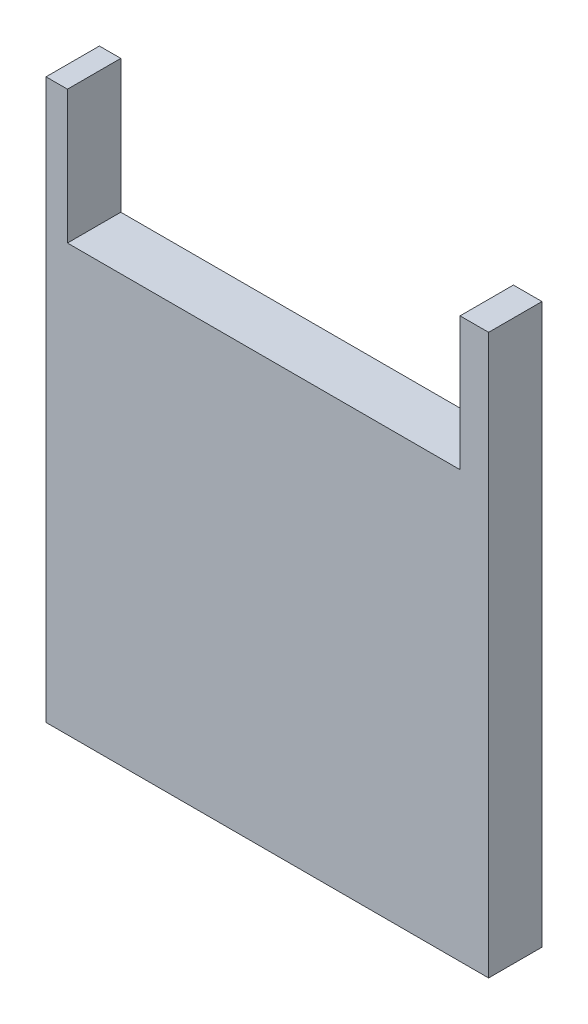
ISO-10303-21;
HEADER;
FILE_DESCRIPTION(('STEP AP214'),'2;1');
FILE_NAME('part.step','',(''),(''),'','','');
FILE_SCHEMA(('AUTOMOTIVE_DESIGN { 1 0 10303 214 1 1 1 1 }'));
ENDSEC;
DATA;
#1=APPLICATION_CONTEXT('core data for automotive mechanical design processes');
#2=APPLICATION_PROTOCOL_DEFINITION('international standard','automotive_design',2000,#1);
#3=PRODUCT_CONTEXT('',#1,'mechanical');
#4=PRODUCT('Part','Part','',(#3));
#5=PRODUCT_RELATED_PRODUCT_CATEGORY('part','',(#4));
#6=PRODUCT_DEFINITION_FORMATION('','',#4);
#7=PRODUCT_DEFINITION_CONTEXT('part definition',#1,'design');
#8=PRODUCT_DEFINITION('design','',#6,#7);
#9=PRODUCT_DEFINITION_SHAPE('','',#8);
#10=(LENGTH_UNIT() NAMED_UNIT(*) SI_UNIT(.MILLI.,.METRE.));
#11=(NAMED_UNIT(*) PLANE_ANGLE_UNIT() SI_UNIT($,.RADIAN.));
#12=(NAMED_UNIT(*) SI_UNIT($,.STERADIAN.) SOLID_ANGLE_UNIT());
#13=UNCERTAINTY_MEASURE_WITH_UNIT(LENGTH_MEASURE(1.E-05),#10,'distance_accuracy_value','');
#14=(GEOMETRIC_REPRESENTATION_CONTEXT(3) GLOBAL_UNCERTAINTY_ASSIGNED_CONTEXT((#13)) GLOBAL_UNIT_ASSIGNED_CONTEXT((#10,
#11,#12)) REPRESENTATION_CONTEXT('',''));
#15=CARTESIAN_POINT('',(0.,0.,0.));
#16=DIRECTION('',(0.,0.,1.));
#17=DIRECTION('',(1.,0.,0.));
#18=AXIS2_PLACEMENT_3D('',#15,#16,#17);
#19=CARTESIAN_POINT('',(22.2134698652141,38.0037677212096,6.));
#20=DIRECTION('',(-1.,0.,0.));
#21=DIRECTION('',(0.,0.,1.));
#22=AXIS2_PLACEMENT_3D('',#19,#20,#21);
#23=PLANE('',#22);
#24=DIRECTION('',(0.,1.,0.));
#25=VECTOR('',#24,1.);
#26=CARTESIAN_POINT('',(22.2134698652141,38.0037677212096,0.));
#27=LINE('',#26,#25);
#28=CARTESIAN_POINT('',(22.2134698652141,-24.8897915357218,0.));
#29=VERTEX_POINT('',#28);
#30=CARTESIAN_POINT('',(22.2134698652141,38.0037677212096,0.));
#31=VERTEX_POINT('',#30);
#32=EDGE_CURVE('E136',#29,#31,#27,.T.);
#33=ORIENTED_EDGE('',*,*,#32,.T.);
#34=DIRECTION('',(0.,0.,-1.));
#35=VECTOR('',#34,1.);
#36=CARTESIAN_POINT('',(22.2134698652141,38.0037677212096,6.));
#37=LINE('',#36,#35);
#38=CARTESIAN_POINT('',(22.2134698652141,38.0037677212096,6.));
#39=VERTEX_POINT('',#38);
#40=EDGE_CURVE('E44',#39,#31,#37,.T.);
#41=ORIENTED_EDGE('',*,*,#40,.F.);
#42=DIRECTION('',(0.,1.,0.));
#43=VECTOR('',#42,1.);
#44=CARTESIAN_POINT('',(22.2134698652141,38.0037677212096,6.));
#45=LINE('',#44,#43);
#46=CARTESIAN_POINT('',(22.2134698652141,-24.8897915357218,6.));
#47=VERTEX_POINT('',#46);
#48=EDGE_CURVE('E96',#47,#39,#45,.T.);
#49=ORIENTED_EDGE('',*,*,#48,.F.);
#50=DIRECTION('',(0.,0.,-1.));
#51=VECTOR('',#50,1.);
#52=CARTESIAN_POINT('',(22.2134698652141,-24.8897915357218,6.));
#53=LINE('',#52,#51);
#54=EDGE_CURVE('E11',#47,#29,#53,.T.);
#55=ORIENTED_EDGE('',*,*,#54,.T.);
#56=EDGE_LOOP('',(#33,#41,#49,#55));
#57=FACE_BOUND('',#56,.T.);
#58=ADVANCED_FACE('F36',(#57),#23,.F.);
#59=CARTESIAN_POINT('',(19.0018838606048,38.0037677212096,6.));
#60=DIRECTION('',(0.,-1.,0.));
#61=DIRECTION('',(0.,0.,-1.));
#62=AXIS2_PLACEMENT_3D('',#59,#60,#61);
#63=PLANE('',#62);
#64=DIRECTION('',(-1.,0.,0.));
#65=VECTOR('',#64,1.);
#66=CARTESIAN_POINT('',(19.0018838606048,38.0037677212096,0.));
#67=LINE('',#66,#65);
#68=CARTESIAN_POINT('',(19.0018838606048,38.0037677212096,0.));
#69=VERTEX_POINT('',#68);
#70=EDGE_CURVE('E138',#31,#69,#67,.T.);
#71=ORIENTED_EDGE('',*,*,#70,.T.);
#72=DIRECTION('',(0.,0.,-1.));
#73=VECTOR('',#72,1.);
#74=CARTESIAN_POINT('',(19.0018838606048,38.0037677212096,6.));
#75=LINE('',#74,#73);
#76=CARTESIAN_POINT('',(19.0018838606048,38.0037677212096,6.));
#77=VERTEX_POINT('',#76);
#78=EDGE_CURVE('E155',#77,#69,#75,.T.);
#79=ORIENTED_EDGE('',*,*,#78,.F.);
#80=DIRECTION('',(-1.,0.,0.));
#81=VECTOR('',#80,1.);
#82=CARTESIAN_POINT('',(19.0018838606048,38.0037677212096,6.));
#83=LINE('',#82,#81);
#84=EDGE_CURVE('E163',#39,#77,#83,.T.);
#85=ORIENTED_EDGE('',*,*,#84,.F.);
#86=ORIENTED_EDGE('',*,*,#40,.T.);
#87=EDGE_LOOP('',(#71,#79,#85,#86));
#88=FACE_BOUND('',#87,.T.);
#89=ADVANCED_FACE('F161',(#88),#63,.F.);
#90=CARTESIAN_POINT('',(19.0018838606048,23.0163663663664,6.));
#91=DIRECTION('',(1.,0.,0.));
#92=DIRECTION('',(0.,0.,-1.));
#93=AXIS2_PLACEMENT_3D('',#90,#91,#92);
#94=PLANE('',#93);
#95=DIRECTION('',(0.,-1.,0.));
#96=VECTOR('',#95,1.);
#97=CARTESIAN_POINT('',(19.0018838606048,23.0163663663664,0.));
#98=LINE('',#97,#96);
#99=CARTESIAN_POINT('',(19.0018838606048,23.0163663663664,0.));
#100=VERTEX_POINT('',#99);
#101=EDGE_CURVE('E140',#69,#100,#98,.T.);
#102=ORIENTED_EDGE('',*,*,#101,.T.);
#103=DIRECTION('',(0.,0.,-1.));
#104=VECTOR('',#103,1.);
#105=CARTESIAN_POINT('',(19.0018838606048,23.0163663663664,6.));
#106=LINE('',#105,#104);
#107=CARTESIAN_POINT('',(19.0018838606048,23.0163663663664,6.));
#108=VERTEX_POINT('',#107);
#109=EDGE_CURVE('E152',#108,#100,#106,.T.);
#110=ORIENTED_EDGE('',*,*,#109,.F.);
#111=DIRECTION('',(0.,-1.,0.));
#112=VECTOR('',#111,1.);
#113=CARTESIAN_POINT('',(19.0018838606048,23.0163663663664,6.));
#114=LINE('',#113,#112);
#115=EDGE_CURVE('E176',#77,#108,#114,.T.);
#116=ORIENTED_EDGE('',*,*,#115,.F.);
#117=ORIENTED_EDGE('',*,*,#78,.T.);
#118=EDGE_LOOP('',(#102,#110,#116,#117));
#119=FACE_BOUND('',#118,.T.);
#120=ADVANCED_FACE('F172',(#119),#94,.F.);
#121=CARTESIAN_POINT('',(-25.1574237027725,23.0163663663664,6.));
#122=DIRECTION('',(0.,-1.,0.));
#123=DIRECTION('',(0.,0.,-1.));
#124=AXIS2_PLACEMENT_3D('',#121,#122,#123);
#125=PLANE('',#124);
#126=DIRECTION('',(-1.,0.,0.));
#127=VECTOR('',#126,1.);
#128=CARTESIAN_POINT('',(-25.1574237027725,23.0163663663664,0.));
#129=LINE('',#128,#127);
#130=CARTESIAN_POINT('',(-25.1574237027725,23.0163663663664,0.));
#131=VERTEX_POINT('',#130);
#132=EDGE_CURVE('E142',#100,#131,#129,.T.);
#133=ORIENTED_EDGE('',*,*,#132,.T.);
#134=DIRECTION('',(0.,0.,-1.));
#135=VECTOR('',#134,1.);
#136=CARTESIAN_POINT('',(-25.1574237027725,23.0163663663664,6.));
#137=LINE('',#136,#135);
#138=CARTESIAN_POINT('',(-25.1574237027725,23.0163663663664,6.));
#139=VERTEX_POINT('',#138);
#140=EDGE_CURVE('E125',#139,#131,#137,.T.);
#141=ORIENTED_EDGE('',*,*,#140,.F.);
#142=DIRECTION('',(-1.,0.,0.));
#143=VECTOR('',#142,1.);
#144=CARTESIAN_POINT('',(-25.1574237027725,23.0163663663664,6.));
#145=LINE('',#144,#143);
#146=EDGE_CURVE('E116',#108,#139,#145,.T.);
#147=ORIENTED_EDGE('',*,*,#146,.F.);
#148=ORIENTED_EDGE('',*,*,#109,.T.);
#149=EDGE_LOOP('',(#133,#141,#147,#148));
#150=FACE_BOUND('',#149,.T.);
#151=ADVANCED_FACE('F175',(#150),#125,.F.);
#152=CARTESIAN_POINT('',(-25.1574237027725,38.0037677212096,6.));
#153=DIRECTION('',(-1.,0.,0.));
#154=DIRECTION('',(0.,0.,1.));
#155=AXIS2_PLACEMENT_3D('',#152,#153,#154);
#156=PLANE('',#155);
#157=DIRECTION('',(0.,1.,0.));
#158=VECTOR('',#157,1.);
#159=CARTESIAN_POINT('',(-25.1574237027725,38.0037677212096,0.));
#160=LINE('',#159,#158);
#161=CARTESIAN_POINT('',(-25.1574237027725,38.0037677212096,0.));
#162=VERTEX_POINT('',#161);
#163=EDGE_CURVE('E124',#131,#162,#160,.T.);
#164=ORIENTED_EDGE('',*,*,#163,.T.);
#165=DIRECTION('',(0.,0.,-1.));
#166=VECTOR('',#165,1.);
#167=CARTESIAN_POINT('',(-25.1574237027725,38.0037677212096,6.));
#168=LINE('',#167,#166);
#169=CARTESIAN_POINT('',(-25.1574237027725,38.0037677212096,6.));
#170=VERTEX_POINT('',#169);
#171=EDGE_CURVE('E121',#170,#162,#168,.T.);
#172=ORIENTED_EDGE('',*,*,#171,.F.);
#173=DIRECTION('',(0.,1.,0.));
#174=VECTOR('',#173,1.);
#175=CARTESIAN_POINT('',(-25.1574237027725,38.0037677212096,6.));
#176=LINE('',#175,#174);
#177=EDGE_CURVE('E110',#139,#170,#176,.T.);
#178=ORIENTED_EDGE('',*,*,#177,.F.);
#179=ORIENTED_EDGE('',*,*,#140,.T.);
#180=EDGE_LOOP('',(#164,#172,#178,#179));
#181=FACE_BOUND('',#180,.T.);
#182=ADVANCED_FACE('F122',(#181),#156,.F.);
#183=CARTESIAN_POINT('',(-27.5661132062295,38.0037677212096,6.));
#184=DIRECTION('',(0.,-1.,0.));
#185=DIRECTION('',(0.,0.,-1.));
#186=AXIS2_PLACEMENT_3D('',#183,#184,#185);
#187=PLANE('',#186);
#188=DIRECTION('',(-1.,0.,0.));
#189=VECTOR('',#188,1.);
#190=CARTESIAN_POINT('',(-27.5661132062295,38.0037677212096,0.));
#191=LINE('',#190,#189);
#192=CARTESIAN_POINT('',(-27.5661132062295,38.0037677212096,0.));
#193=VERTEX_POINT('',#192);
#194=EDGE_CURVE('E82',#162,#193,#191,.T.);
#195=ORIENTED_EDGE('',*,*,#194,.T.);
#196=DIRECTION('',(0.,0.,-1.));
#197=VECTOR('',#196,1.);
#198=CARTESIAN_POINT('',(-27.5661132062295,38.0037677212096,6.));
#199=LINE('',#198,#197);
#200=CARTESIAN_POINT('',(-27.5661132062295,38.0037677212096,6.));
#201=VERTEX_POINT('',#200);
#202=EDGE_CURVE('E126',#201,#193,#199,.T.);
#203=ORIENTED_EDGE('',*,*,#202,.F.);
#204=DIRECTION('',(-1.,0.,0.));
#205=VECTOR('',#204,1.);
#206=CARTESIAN_POINT('',(-27.5661132062295,38.0037677212096,6.));
#207=LINE('',#206,#205);
#208=EDGE_CURVE('E114',#170,#201,#207,.T.);
#209=ORIENTED_EDGE('',*,*,#208,.F.);
#210=ORIENTED_EDGE('',*,*,#171,.T.);
#211=EDGE_LOOP('',(#195,#203,#209,#210));
#212=FACE_BOUND('',#211,.T.);
#213=ADVANCED_FACE('F128',(#212),#187,.F.);
#214=CARTESIAN_POINT('',(-27.5661132062295,-24.8897915357218,6.));
#215=DIRECTION('',(1.,0.,0.));
#216=DIRECTION('',(0.,0.,-1.));
#217=AXIS2_PLACEMENT_3D('',#214,#215,#216);
#218=PLANE('',#217);
#219=DIRECTION('',(0.,-1.,0.));
#220=VECTOR('',#219,1.);
#221=CARTESIAN_POINT('',(-27.5661132062295,-24.8897915357218,0.));
#222=LINE('',#221,#220);
#223=CARTESIAN_POINT('',(-27.5661132062295,-24.8897915357218,0.));
#224=VERTEX_POINT('',#223);
#225=EDGE_CURVE('E89',#193,#224,#222,.T.);
#226=ORIENTED_EDGE('',*,*,#225,.T.);
#227=DIRECTION('',(0.,0.,-1.));
#228=VECTOR('',#227,1.);
#229=CARTESIAN_POINT('',(-27.5661132062295,-24.8897915357218,6.));
#230=LINE('',#229,#228);
#231=CARTESIAN_POINT('',(-27.5661132062295,-24.8897915357218,6.));
#232=VERTEX_POINT('',#231);
#233=EDGE_CURVE('E132',#232,#224,#230,.T.);
#234=ORIENTED_EDGE('',*,*,#233,.F.);
#235=DIRECTION('',(0.,-1.,0.));
#236=VECTOR('',#235,1.);
#237=CARTESIAN_POINT('',(-27.5661132062295,-24.8897915357218,6.));
#238=LINE('',#237,#236);
#239=EDGE_CURVE('E130',#201,#232,#238,.T.);
#240=ORIENTED_EDGE('',*,*,#239,.F.);
#241=ORIENTED_EDGE('',*,*,#202,.T.);
#242=EDGE_LOOP('',(#226,#234,#240,#241));
#243=FACE_BOUND('',#242,.T.);
#244=ADVANCED_FACE('F197',(#243),#218,.F.);
#245=CARTESIAN_POINT('',(19.0018838606048,-24.8897915357218,6.));
#246=DIRECTION('',(0.,1.,0.));
#247=DIRECTION('',(0.,0.,1.));
#248=AXIS2_PLACEMENT_3D('',#245,#246,#247);
#249=PLANE('',#248);
#250=DIRECTION('',(1.,0.,0.));
#251=VECTOR('',#250,1.);
#252=CARTESIAN_POINT('',(19.0018838606048,-24.8897915357218,0.));
#253=LINE('',#252,#251);
#254=EDGE_CURVE('E147',#224,#29,#253,.T.);
#255=ORIENTED_EDGE('',*,*,#254,.T.);
#256=ORIENTED_EDGE('',*,*,#54,.F.);
#257=DIRECTION('',(1.,0.,0.));
#258=VECTOR('',#257,1.);
#259=CARTESIAN_POINT('',(22.2134698652141,-24.8897915357218,6.));
#260=LINE('',#259,#258);
#261=EDGE_CURVE('E52',#232,#47,#260,.T.);
#262=ORIENTED_EDGE('',*,*,#261,.F.);
#263=ORIENTED_EDGE('',*,*,#233,.T.);
#264=EDGE_LOOP('',(#255,#256,#262,#263));
#265=FACE_BOUND('',#264,.T.);
#266=ADVANCED_FACE('F181',(#265),#249,.F.);
#267=CARTESIAN_POINT('',(0.,0.,6.));
#268=DIRECTION('',(0.,0.,-1.));
#269=DIRECTION('',(-1.,0.,0.));
#270=AXIS2_PLACEMENT_3D('',#267,#268,#269);
#271=PLANE('',#270);
#272=ORIENTED_EDGE('',*,*,#261,.T.);
#273=ORIENTED_EDGE('',*,*,#48,.T.);
#274=ORIENTED_EDGE('',*,*,#84,.T.);
#275=ORIENTED_EDGE('',*,*,#115,.T.);
#276=ORIENTED_EDGE('',*,*,#146,.T.);
#277=ORIENTED_EDGE('',*,*,#177,.T.);
#278=ORIENTED_EDGE('',*,*,#208,.T.);
#279=ORIENTED_EDGE('',*,*,#239,.T.);
#280=EDGE_LOOP('',(#272,#273,#274,#275,#276,#277,#278,#279));
#281=FACE_BOUND('',#280,.T.);
#282=ADVANCED_FACE('F112',(#281),#271,.F.);
#283=CARTESIAN_POINT('',(0.,0.,0.));
#284=DIRECTION('',(0.,0.,-1.));
#285=DIRECTION('',(-1.,0.,0.));
#286=AXIS2_PLACEMENT_3D('',#283,#284,#285);
#287=PLANE('',#286);
#288=ORIENTED_EDGE('',*,*,#32,.F.);
#289=ORIENTED_EDGE('',*,*,#254,.F.);
#290=ORIENTED_EDGE('',*,*,#225,.F.);
#291=ORIENTED_EDGE('',*,*,#194,.F.);
#292=ORIENTED_EDGE('',*,*,#163,.F.);
#293=ORIENTED_EDGE('',*,*,#132,.F.);
#294=ORIENTED_EDGE('',*,*,#101,.F.);
#295=ORIENTED_EDGE('',*,*,#70,.F.);
#296=EDGE_LOOP('',(#288,#289,#290,#291,#292,#293,#294,#295));
#297=FACE_BOUND('',#296,.T.);
#298=ADVANCED_FACE('F167',(#297),#287,.T.);
#299=CLOSED_SHELL('',(#58,#89,#120,#151,#182,#213,#244,#266,#282,#298));
#300=MANIFOLD_SOLID_BREP('B2',#299);
#301=ADVANCED_BREP_SHAPE_REPRESENTATION('',(#18,#300),#14);
#302=SHAPE_DEFINITION_REPRESENTATION(#9,#301);
ENDSEC;
END-ISO-10303-21;
